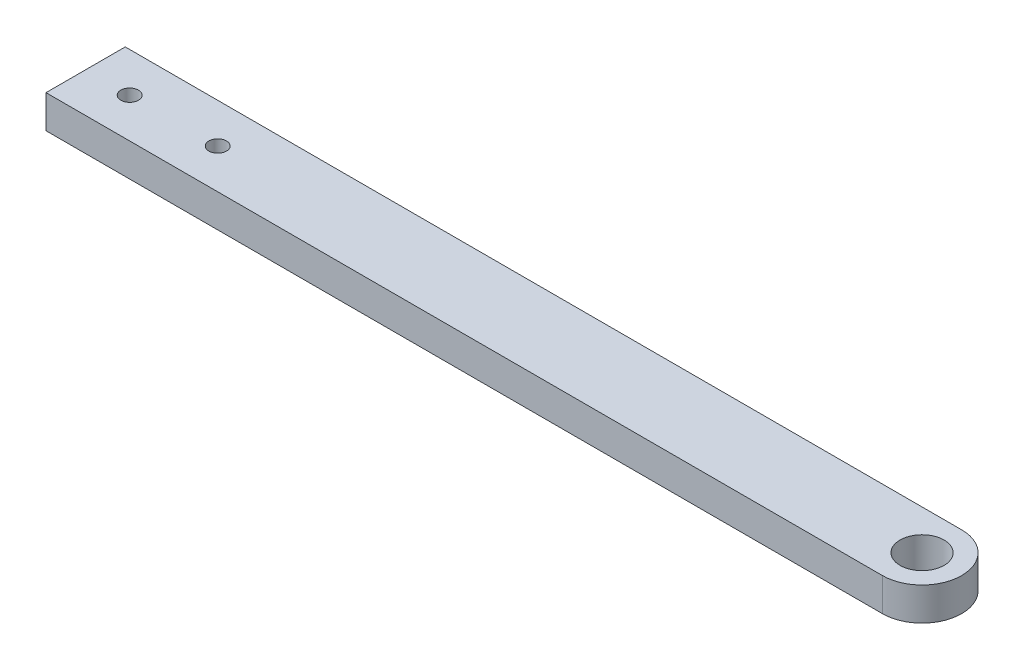
ISO-10303-21;
HEADER;
FILE_DESCRIPTION(('STEP AP214'),'2;1');
FILE_NAME('part.step','',(''),(''),'','','');
FILE_SCHEMA(('AUTOMOTIVE_DESIGN { 1 0 10303 214 1 1 1 1 }'));
ENDSEC;
DATA;
#1=APPLICATION_CONTEXT('core data for automotive mechanical design processes');
#2=APPLICATION_PROTOCOL_DEFINITION('international standard','automotive_design',2000,#1);
#3=PRODUCT_CONTEXT('',#1,'mechanical');
#4=PRODUCT('Part','Part','',(#3));
#5=PRODUCT_RELATED_PRODUCT_CATEGORY('part','',(#4));
#6=PRODUCT_DEFINITION_FORMATION('','',#4);
#7=PRODUCT_DEFINITION_CONTEXT('part definition',#1,'design');
#8=PRODUCT_DEFINITION('design','',#6,#7);
#9=PRODUCT_DEFINITION_SHAPE('','',#8);
#10=(LENGTH_UNIT() NAMED_UNIT(*) SI_UNIT(.MILLI.,.METRE.));
#11=(NAMED_UNIT(*) PLANE_ANGLE_UNIT() SI_UNIT($,.RADIAN.));
#12=(NAMED_UNIT(*) SI_UNIT($,.STERADIAN.) SOLID_ANGLE_UNIT());
#13=UNCERTAINTY_MEASURE_WITH_UNIT(LENGTH_MEASURE(1.E-05),#10,'distance_accuracy_value','');
#14=(GEOMETRIC_REPRESENTATION_CONTEXT(3) GLOBAL_UNCERTAINTY_ASSIGNED_CONTEXT((#13)) GLOBAL_UNIT_ASSIGNED_CONTEXT((#10,
#11,#12)) REPRESENTATION_CONTEXT('',''));
#15=CARTESIAN_POINT('',(0.,0.,0.));
#16=DIRECTION('',(0.,0.,1.));
#17=DIRECTION('',(1.,0.,0.));
#18=AXIS2_PLACEMENT_3D('',#15,#16,#17);
#19=CARTESIAN_POINT('',(0.,7.5,0.));
#20=DIRECTION('',(0.,-1.,0.));
#21=DIRECTION('',(0.,0.,-1.));
#22=AXIS2_PLACEMENT_3D('',#19,#20,#21);
#23=CYLINDRICAL_SURFACE('',#22,9.);
#24=CARTESIAN_POINT('',(0.,0.,0.));
#25=DIRECTION('',(0.,1.,0.));
#26=DIRECTION('',(0.,0.,1.));
#27=AXIS2_PLACEMENT_3D('',#24,#25,#26);
#28=CIRCLE('',#27,9.);
#29=CARTESIAN_POINT('',(0.,0.,9.));
#30=VERTEX_POINT('',#29);
#31=CARTESIAN_POINT('',(0.,0.,-9.));
#32=VERTEX_POINT('',#31);
#33=EDGE_CURVE('E113',#30,#32,#28,.T.);
#34=ORIENTED_EDGE('',*,*,#33,.T.);
#35=DIRECTION('',(0.,-1.,0.));
#36=VECTOR('',#35,1.);
#37=CARTESIAN_POINT('',(0.,7.5,-9.));
#38=LINE('',#37,#36);
#39=CARTESIAN_POINT('',(0.,7.5,-9.));
#40=VERTEX_POINT('',#39);
#41=EDGE_CURVE('E11',#40,#32,#38,.T.);
#42=ORIENTED_EDGE('',*,*,#41,.F.);
#43=CARTESIAN_POINT('',(0.,7.5,0.));
#44=DIRECTION('',(0.,1.,0.));
#45=DIRECTION('',(0.,0.,1.));
#46=AXIS2_PLACEMENT_3D('',#43,#44,#45);
#47=CIRCLE('',#46,9.);
#48=CARTESIAN_POINT('',(0.,7.5,9.));
#49=VERTEX_POINT('',#48);
#50=EDGE_CURVE('E97',#49,#40,#47,.T.);
#51=ORIENTED_EDGE('',*,*,#50,.F.);
#52=DIRECTION('',(0.,-1.,0.));
#53=VECTOR('',#52,1.);
#54=CARTESIAN_POINT('',(0.,7.5,9.));
#55=LINE('',#54,#53);
#56=EDGE_CURVE('E109',#49,#30,#55,.T.);
#57=ORIENTED_EDGE('',*,*,#56,.T.);
#58=EDGE_LOOP('',(#34,#42,#51,#57));
#59=FACE_BOUND('',#58,.T.);
#60=ADVANCED_FACE('F45',(#59),#23,.T.);
#61=CARTESIAN_POINT('',(0.,7.5,-9.));
#62=DIRECTION('',(0.,0.,1.));
#63=DIRECTION('',(1.,0.,0.));
#64=AXIS2_PLACEMENT_3D('',#61,#62,#63);
#65=PLANE('',#64);
#66=DIRECTION('',(-1.,0.,0.));
#67=VECTOR('',#66,1.);
#68=CARTESIAN_POINT('',(0.,0.,-9.));
#69=LINE('',#68,#67);
#70=CARTESIAN_POINT('',(-190.,0.,-9.));
#71=VERTEX_POINT('',#70);
#72=EDGE_CURVE('E102',#32,#71,#69,.T.);
#73=ORIENTED_EDGE('',*,*,#72,.T.);
#74=DIRECTION('',(0.,-1.,0.));
#75=VECTOR('',#74,1.);
#76=CARTESIAN_POINT('',(-190.,7.5,-9.));
#77=LINE('',#76,#75);
#78=CARTESIAN_POINT('',(-190.,7.5,-9.));
#79=VERTEX_POINT('',#78);
#80=EDGE_CURVE('E54',#79,#71,#77,.T.);
#81=ORIENTED_EDGE('',*,*,#80,.F.);
#82=DIRECTION('',(-1.,0.,0.));
#83=VECTOR('',#82,1.);
#84=CARTESIAN_POINT('',(0.,7.5,-9.));
#85=LINE('',#84,#83);
#86=EDGE_CURVE('E92',#40,#79,#85,.T.);
#87=ORIENTED_EDGE('',*,*,#86,.F.);
#88=ORIENTED_EDGE('',*,*,#41,.T.);
#89=EDGE_LOOP('',(#73,#81,#87,#88));
#90=FACE_BOUND('',#89,.T.);
#91=ADVANCED_FACE('F101',(#90),#65,.F.);
#92=CARTESIAN_POINT('',(-190.,7.5,-9.));
#93=DIRECTION('',(1.,0.,0.));
#94=DIRECTION('',(0.,0.,-1.));
#95=AXIS2_PLACEMENT_3D('',#92,#93,#94);
#96=PLANE('',#95);
#97=DIRECTION('',(0.,0.,1.));
#98=VECTOR('',#97,1.);
#99=CARTESIAN_POINT('',(-190.,0.,-9.));
#100=LINE('',#99,#98);
#101=CARTESIAN_POINT('',(-190.,0.,9.));
#102=VERTEX_POINT('',#101);
#103=EDGE_CURVE('E79',#71,#102,#100,.T.);
#104=ORIENTED_EDGE('',*,*,#103,.T.);
#105=DIRECTION('',(0.,-1.,0.));
#106=VECTOR('',#105,1.);
#107=CARTESIAN_POINT('',(-190.,7.5,9.));
#108=LINE('',#107,#106);
#109=CARTESIAN_POINT('',(-190.,7.5,9.));
#110=VERTEX_POINT('',#109);
#111=EDGE_CURVE('E104',#110,#102,#108,.T.);
#112=ORIENTED_EDGE('',*,*,#111,.F.);
#113=DIRECTION('',(0.,0.,1.));
#114=VECTOR('',#113,1.);
#115=CARTESIAN_POINT('',(-190.,7.5,-9.));
#116=LINE('',#115,#114);
#117=EDGE_CURVE('E95',#79,#110,#116,.T.);
#118=ORIENTED_EDGE('',*,*,#117,.F.);
#119=ORIENTED_EDGE('',*,*,#80,.T.);
#120=EDGE_LOOP('',(#104,#112,#118,#119));
#121=FACE_BOUND('',#120,.T.);
#122=ADVANCED_FACE('F105',(#121),#96,.F.);
#123=CARTESIAN_POINT('',(-190.,7.5,9.));
#124=DIRECTION('',(0.,0.,-1.));
#125=DIRECTION('',(-1.,0.,0.));
#126=AXIS2_PLACEMENT_3D('',#123,#124,#125);
#127=PLANE('',#126);
#128=DIRECTION('',(1.,0.,0.));
#129=VECTOR('',#128,1.);
#130=CARTESIAN_POINT('',(-190.,0.,9.));
#131=LINE('',#130,#129);
#132=EDGE_CURVE('E85',#102,#30,#131,.T.);
#133=ORIENTED_EDGE('',*,*,#132,.T.);
#134=ORIENTED_EDGE('',*,*,#56,.F.);
#135=DIRECTION('',(1.,0.,0.));
#136=VECTOR('',#135,1.);
#137=CARTESIAN_POINT('',(-190.,7.5,9.));
#138=LINE('',#137,#136);
#139=EDGE_CURVE('E62',#110,#49,#138,.T.);
#140=ORIENTED_EDGE('',*,*,#139,.F.);
#141=ORIENTED_EDGE('',*,*,#111,.T.);
#142=EDGE_LOOP('',(#133,#134,#140,#141));
#143=FACE_BOUND('',#142,.T.);
#144=ADVANCED_FACE('F127',(#143),#127,.F.);
#145=CARTESIAN_POINT('',(0.,7.5,0.));
#146=DIRECTION('',(0.,1.,0.));
#147=DIRECTION('',(0.,0.,1.));
#148=AXIS2_PLACEMENT_3D('',#145,#146,#147);
#149=PLANE('',#148);
#150=CARTESIAN_POINT('',(0.,7.5,0.));
#151=DIRECTION('',(0.,1.,0.));
#152=DIRECTION('',(0.,0.,1.));
#153=AXIS2_PLACEMENT_3D('',#150,#151,#152);
#154=CIRCLE('',#153,5.);
#155=CARTESIAN_POINT('',(0.,7.5,5.));
#156=VERTEX_POINT('',#155);
#157=EDGE_CURVE('E150',#156,#156,#154,.T.);
#158=ORIENTED_EDGE('',*,*,#157,.F.);
#159=EDGE_LOOP('',(#158));
#160=FACE_BOUND('',#159,.T.);
#161=CARTESIAN_POINT('',(-180.,7.5,0.));
#162=DIRECTION('',(0.,1.,0.));
#163=DIRECTION('',(0.,0.,1.));
#164=AXIS2_PLACEMENT_3D('',#161,#162,#163);
#165=CIRCLE('',#164,2.);
#166=CARTESIAN_POINT('',(-180.,7.5,2.));
#167=VERTEX_POINT('',#166);
#168=EDGE_CURVE('E143',#167,#167,#165,.T.);
#169=ORIENTED_EDGE('',*,*,#168,.F.);
#170=EDGE_LOOP('',(#169));
#171=FACE_BOUND('',#170,.T.);
#172=CARTESIAN_POINT('',(-160.,7.5,0.));
#173=DIRECTION('',(0.,1.,0.));
#174=DIRECTION('',(0.,0.,1.));
#175=AXIS2_PLACEMENT_3D('',#172,#173,#174);
#176=CIRCLE('',#175,2.);
#177=CARTESIAN_POINT('',(-160.,7.5,2.));
#178=VERTEX_POINT('',#177);
#179=EDGE_CURVE('E138',#178,#178,#176,.T.);
#180=ORIENTED_EDGE('',*,*,#179,.F.);
#181=EDGE_LOOP('',(#180));
#182=FACE_BOUND('',#181,.T.);
#183=ORIENTED_EDGE('',*,*,#50,.T.);
#184=ORIENTED_EDGE('',*,*,#86,.T.);
#185=ORIENTED_EDGE('',*,*,#117,.T.);
#186=ORIENTED_EDGE('',*,*,#139,.T.);
#187=EDGE_LOOP('',(#183,#184,#185,#186));
#188=FACE_BOUND('',#187,.T.);
#189=ADVANCED_FACE('F93',(#160,#171,#182,#188),#149,.T.);
#190=CARTESIAN_POINT('',(0.,0.,0.));
#191=DIRECTION('',(0.,1.,0.));
#192=DIRECTION('',(0.,0.,1.));
#193=AXIS2_PLACEMENT_3D('',#190,#191,#192);
#194=PLANE('',#193);
#195=CARTESIAN_POINT('',(0.,0.,0.));
#196=DIRECTION('',(0.,1.,0.));
#197=DIRECTION('',(0.,0.,1.));
#198=AXIS2_PLACEMENT_3D('',#195,#196,#197);
#199=CIRCLE('',#198,5.);
#200=CARTESIAN_POINT('',(0.,0.,5.));
#201=VERTEX_POINT('',#200);
#202=EDGE_CURVE('E139',#201,#201,#199,.T.);
#203=ORIENTED_EDGE('',*,*,#202,.T.);
#204=EDGE_LOOP('',(#203));
#205=FACE_BOUND('',#204,.T.);
#206=CARTESIAN_POINT('',(-180.,0.,0.));
#207=DIRECTION('',(0.,1.,0.));
#208=DIRECTION('',(0.,0.,1.));
#209=AXIS2_PLACEMENT_3D('',#206,#207,#208);
#210=CIRCLE('',#209,2.);
#211=CARTESIAN_POINT('',(-180.,0.,2.));
#212=VERTEX_POINT('',#211);
#213=EDGE_CURVE('E117',#212,#212,#210,.T.);
#214=ORIENTED_EDGE('',*,*,#213,.T.);
#215=EDGE_LOOP('',(#214));
#216=FACE_BOUND('',#215,.T.);
#217=CARTESIAN_POINT('',(-160.,0.,0.));
#218=DIRECTION('',(0.,1.,0.));
#219=DIRECTION('',(0.,0.,1.));
#220=AXIS2_PLACEMENT_3D('',#217,#218,#219);
#221=CIRCLE('',#220,2.);
#222=CARTESIAN_POINT('',(-160.,0.,2.));
#223=VERTEX_POINT('',#222);
#224=EDGE_CURVE('E134',#223,#223,#221,.T.);
#225=ORIENTED_EDGE('',*,*,#224,.T.);
#226=EDGE_LOOP('',(#225));
#227=FACE_BOUND('',#226,.T.);
#228=ORIENTED_EDGE('',*,*,#33,.F.);
#229=ORIENTED_EDGE('',*,*,#132,.F.);
#230=ORIENTED_EDGE('',*,*,#103,.F.);
#231=ORIENTED_EDGE('',*,*,#72,.F.);
#232=EDGE_LOOP('',(#228,#229,#230,#231));
#233=FACE_BOUND('',#232,.T.);
#234=ADVANCED_FACE('F130',(#205,#216,#227,#233),#194,.F.);
#235=CARTESIAN_POINT('',(-160.,0.,0.));
#236=DIRECTION('',(0.,1.,0.));
#237=DIRECTION('',(0.,0.,1.));
#238=AXIS2_PLACEMENT_3D('',#235,#236,#237);
#239=CYLINDRICAL_SURFACE('',#238,2.);
#240=ORIENTED_EDGE('',*,*,#224,.F.);
#241=EDGE_LOOP('',(#240));
#242=FACE_BOUND('',#241,.T.);
#243=ORIENTED_EDGE('',*,*,#179,.T.);
#244=EDGE_LOOP('',(#243));
#245=FACE_BOUND('',#244,.T.);
#246=ADVANCED_FACE('F174',(#242,#245),#239,.F.);
#247=CARTESIAN_POINT('',(-180.,0.,0.));
#248=DIRECTION('',(0.,1.,0.));
#249=DIRECTION('',(0.,0.,1.));
#250=AXIS2_PLACEMENT_3D('',#247,#248,#249);
#251=CYLINDRICAL_SURFACE('',#250,2.);
#252=ORIENTED_EDGE('',*,*,#213,.F.);
#253=EDGE_LOOP('',(#252));
#254=FACE_BOUND('',#253,.T.);
#255=ORIENTED_EDGE('',*,*,#168,.T.);
#256=EDGE_LOOP('',(#255));
#257=FACE_BOUND('',#256,.T.);
#258=ADVANCED_FACE('F163',(#254,#257),#251,.F.);
#259=CARTESIAN_POINT('',(0.,0.,0.));
#260=DIRECTION('',(0.,1.,0.));
#261=DIRECTION('',(0.,0.,1.));
#262=AXIS2_PLACEMENT_3D('',#259,#260,#261);
#263=CYLINDRICAL_SURFACE('',#262,5.);
#264=ORIENTED_EDGE('',*,*,#202,.F.);
#265=EDGE_LOOP('',(#264));
#266=FACE_BOUND('',#265,.T.);
#267=ORIENTED_EDGE('',*,*,#157,.T.);
#268=EDGE_LOOP('',(#267));
#269=FACE_BOUND('',#268,.T.);
#270=ADVANCED_FACE('F160',(#266,#269),#263,.F.);
#271=CLOSED_SHELL('',(#60,#91,#122,#144,#189,#234,#246,#258,#270));
#272=MANIFOLD_SOLID_BREP('B2',#271);
#273=ADVANCED_BREP_SHAPE_REPRESENTATION('',(#18,#272),#14);
#274=SHAPE_DEFINITION_REPRESENTATION(#9,#273);
ENDSEC;
END-ISO-10303-21;
